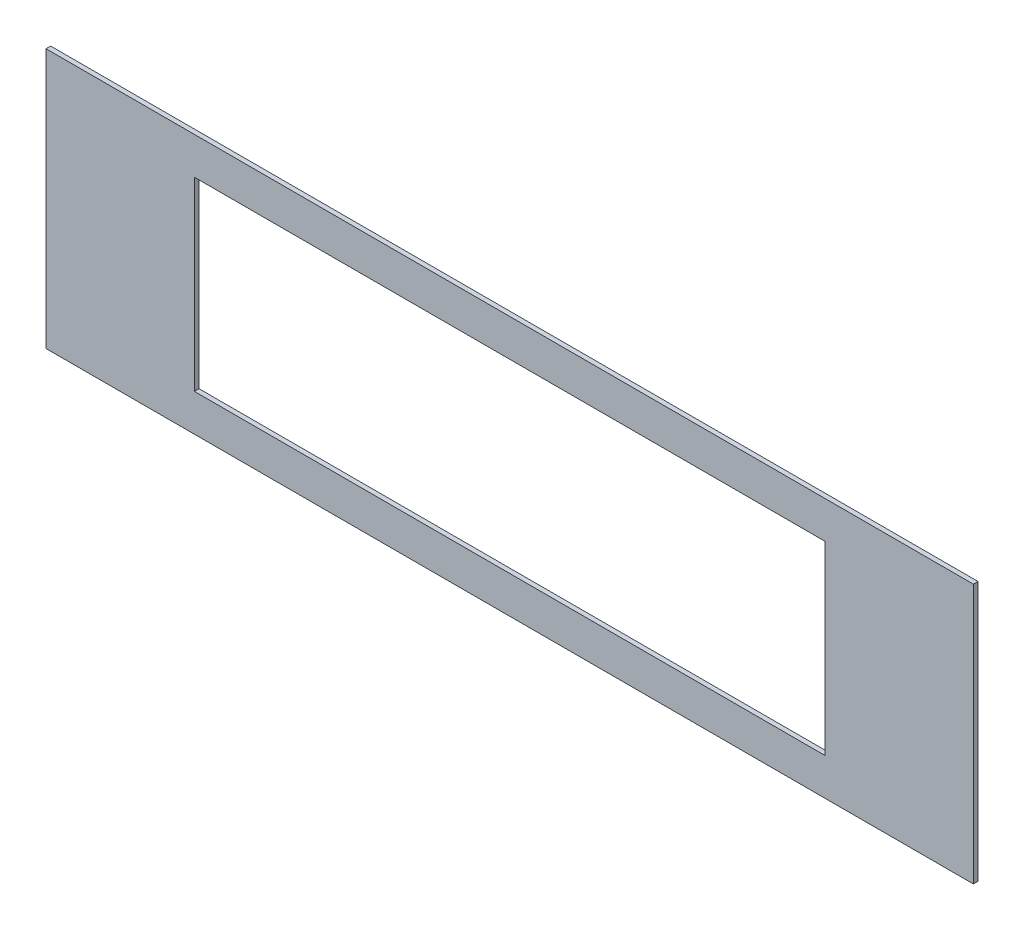
ISO-10303-21;
HEADER;
FILE_DESCRIPTION(('STEP AP214'),'2;1');
FILE_NAME('part.step','',(''),(''),'','','');
FILE_SCHEMA(('AUTOMOTIVE_DESIGN { 1 0 10303 214 1 1 1 1 }'));
ENDSEC;
DATA;
#1=APPLICATION_CONTEXT('core data for automotive mechanical design processes');
#2=APPLICATION_PROTOCOL_DEFINITION('international standard','automotive_design',2000,#1);
#3=PRODUCT_CONTEXT('',#1,'mechanical');
#4=PRODUCT('Part','Part','',(#3));
#5=PRODUCT_RELATED_PRODUCT_CATEGORY('part','',(#4));
#6=PRODUCT_DEFINITION_FORMATION('','',#4);
#7=PRODUCT_DEFINITION_CONTEXT('part definition',#1,'design');
#8=PRODUCT_DEFINITION('design','',#6,#7);
#9=PRODUCT_DEFINITION_SHAPE('','',#8);
#10=(LENGTH_UNIT() NAMED_UNIT(*) SI_UNIT(.MILLI.,.METRE.));
#11=(NAMED_UNIT(*) PLANE_ANGLE_UNIT() SI_UNIT($,.RADIAN.));
#12=(NAMED_UNIT(*) SI_UNIT($,.STERADIAN.) SOLID_ANGLE_UNIT());
#13=UNCERTAINTY_MEASURE_WITH_UNIT(LENGTH_MEASURE(1.E-05),#10,'distance_accuracy_value','');
#14=(GEOMETRIC_REPRESENTATION_CONTEXT(3) GLOBAL_UNCERTAINTY_ASSIGNED_CONTEXT((#13)) GLOBAL_UNIT_ASSIGNED_CONTEXT((#10,
#11,#12)) REPRESENTATION_CONTEXT('',''));
#15=CARTESIAN_POINT('',(0.,0.,0.));
#16=DIRECTION('',(0.,0.,1.));
#17=DIRECTION('',(1.,0.,0.));
#18=AXIS2_PLACEMENT_3D('',#15,#16,#17);
#19=CARTESIAN_POINT('',(0.,0.,6.35));
#20=DIRECTION('',(0.,0.,1.));
#21=DIRECTION('',(1.,0.,0.));
#22=AXIS2_PLACEMENT_3D('',#19,#20,#21);
#23=PLANE('',#22);
#24=DIRECTION('',(0.,-1.,0.));
#25=VECTOR('',#24,1.);
#26=CARTESIAN_POINT('',(-635.,-177.8,6.35));
#27=LINE('',#26,#25);
#28=CARTESIAN_POINT('',(-635.,177.8,6.35));
#29=VERTEX_POINT('',#28);
#30=CARTESIAN_POINT('',(-635.,-177.8,6.35));
#31=VERTEX_POINT('',#30);
#32=EDGE_CURVE('E153',#29,#31,#27,.T.);
#33=ORIENTED_EDGE('',*,*,#32,.T.);
#34=DIRECTION('',(1.,0.,0.));
#35=VECTOR('',#34,1.);
#36=CARTESIAN_POINT('',(635.,-177.8,6.35));
#37=LINE('',#36,#35);
#38=CARTESIAN_POINT('',(635.,-177.8,6.35));
#39=VERTEX_POINT('',#38);
#40=EDGE_CURVE('E157',#31,#39,#37,.T.);
#41=ORIENTED_EDGE('',*,*,#40,.T.);
#42=DIRECTION('',(0.,1.,0.));
#43=VECTOR('',#42,1.);
#44=CARTESIAN_POINT('',(635.,-177.8,6.35));
#45=LINE('',#44,#43);
#46=CARTESIAN_POINT('',(635.,177.8,6.35));
#47=VERTEX_POINT('',#46);
#48=EDGE_CURVE('E161',#39,#47,#45,.T.);
#49=ORIENTED_EDGE('',*,*,#48,.T.);
#50=DIRECTION('',(-1.,0.,0.));
#51=VECTOR('',#50,1.);
#52=CARTESIAN_POINT('',(635.,177.8,6.35));
#53=LINE('',#52,#51);
#54=EDGE_CURVE('E164',#47,#29,#53,.T.);
#55=ORIENTED_EDGE('',*,*,#54,.T.);
#56=EDGE_LOOP('',(#33,#41,#49,#55));
#57=FACE_BOUND('',#56,.T.);
#58=DIRECTION('',(1.,0.,0.));
#59=VECTOR('',#58,1.);
#60=CARTESIAN_POINT('',(431.8,-127.,6.35));
#61=LINE('',#60,#59);
#62=CARTESIAN_POINT('',(-431.8,-127.,6.35));
#63=VERTEX_POINT('',#62);
#64=CARTESIAN_POINT('',(431.8,-127.,6.35));
#65=VERTEX_POINT('',#64);
#66=EDGE_CURVE('E114',#63,#65,#61,.T.);
#67=ORIENTED_EDGE('',*,*,#66,.F.);
#68=DIRECTION('',(0.,-1.,0.));
#69=VECTOR('',#68,1.);
#70=CARTESIAN_POINT('',(-431.8,-127.,6.35));
#71=LINE('',#70,#69);
#72=CARTESIAN_POINT('',(-431.8,127.,6.35));
#73=VERTEX_POINT('',#72);
#74=EDGE_CURVE('E105',#73,#63,#71,.T.);
#75=ORIENTED_EDGE('',*,*,#74,.F.);
#76=DIRECTION('',(-1.,0.,0.));
#77=VECTOR('',#76,1.);
#78=CARTESIAN_POINT('',(431.8,127.,6.35));
#79=LINE('',#78,#77);
#80=CARTESIAN_POINT('',(431.8,127.,6.35));
#81=VERTEX_POINT('',#80);
#82=EDGE_CURVE('E131',#81,#73,#79,.T.);
#83=ORIENTED_EDGE('',*,*,#82,.F.);
#84=DIRECTION('',(0.,1.,0.));
#85=VECTOR('',#84,1.);
#86=CARTESIAN_POINT('',(431.8,-127.,6.35));
#87=LINE('',#86,#85);
#88=EDGE_CURVE('E127',#65,#81,#87,.T.);
#89=ORIENTED_EDGE('',*,*,#88,.F.);
#90=EDGE_LOOP('',(#67,#75,#83,#89));
#91=FACE_BOUND('',#90,.T.);
#92=ADVANCED_FACE('F39',(#57,#91),#23,.T.);
#93=CARTESIAN_POINT('',(0.,0.,0.));
#94=DIRECTION('',(0.,0.,1.));
#95=DIRECTION('',(1.,0.,0.));
#96=AXIS2_PLACEMENT_3D('',#93,#94,#95);
#97=PLANE('',#96);
#98=DIRECTION('',(0.,-1.,0.));
#99=VECTOR('',#98,1.);
#100=CARTESIAN_POINT('',(-635.,-177.8,0.));
#101=LINE('',#100,#99);
#102=CARTESIAN_POINT('',(-635.,177.8,0.));
#103=VERTEX_POINT('',#102);
#104=CARTESIAN_POINT('',(-635.,-177.8,0.));
#105=VERTEX_POINT('',#104);
#106=EDGE_CURVE('E123',#103,#105,#101,.T.);
#107=ORIENTED_EDGE('',*,*,#106,.F.);
#108=DIRECTION('',(-1.,0.,0.));
#109=VECTOR('',#108,1.);
#110=CARTESIAN_POINT('',(635.,177.8,0.));
#111=LINE('',#110,#109);
#112=CARTESIAN_POINT('',(635.,177.8,0.));
#113=VERTEX_POINT('',#112);
#114=EDGE_CURVE('E158',#113,#103,#111,.T.);
#115=ORIENTED_EDGE('',*,*,#114,.F.);
#116=DIRECTION('',(0.,1.,0.));
#117=VECTOR('',#116,1.);
#118=CARTESIAN_POINT('',(635.,-177.8,0.));
#119=LINE('',#118,#117);
#120=CARTESIAN_POINT('',(635.,-177.8,0.));
#121=VERTEX_POINT('',#120);
#122=EDGE_CURVE('E174',#121,#113,#119,.T.);
#123=ORIENTED_EDGE('',*,*,#122,.F.);
#124=DIRECTION('',(1.,0.,0.));
#125=VECTOR('',#124,1.);
#126=CARTESIAN_POINT('',(635.,-177.8,0.));
#127=LINE('',#126,#125);
#128=EDGE_CURVE('E171',#105,#121,#127,.T.);
#129=ORIENTED_EDGE('',*,*,#128,.F.);
#130=EDGE_LOOP('',(#107,#115,#123,#129));
#131=FACE_BOUND('',#130,.T.);
#132=DIRECTION('',(0.,-1.,0.));
#133=VECTOR('',#132,1.);
#134=CARTESIAN_POINT('',(-431.8,-127.,0.));
#135=LINE('',#134,#133);
#136=CARTESIAN_POINT('',(-431.8,127.,0.));
#137=VERTEX_POINT('',#136);
#138=CARTESIAN_POINT('',(-431.8,-127.,0.));
#139=VERTEX_POINT('',#138);
#140=EDGE_CURVE('E63',#137,#139,#135,.T.);
#141=ORIENTED_EDGE('',*,*,#140,.T.);
#142=DIRECTION('',(1.,0.,0.));
#143=VECTOR('',#142,1.);
#144=CARTESIAN_POINT('',(431.8,-127.,0.));
#145=LINE('',#144,#143);
#146=CARTESIAN_POINT('',(431.8,-127.,0.));
#147=VERTEX_POINT('',#146);
#148=EDGE_CURVE('E121',#139,#147,#145,.T.);
#149=ORIENTED_EDGE('',*,*,#148,.T.);
#150=DIRECTION('',(0.,1.,0.));
#151=VECTOR('',#150,1.);
#152=CARTESIAN_POINT('',(431.8,-127.,0.));
#153=LINE('',#152,#151);
#154=CARTESIAN_POINT('',(431.8,127.,0.));
#155=VERTEX_POINT('',#154);
#156=EDGE_CURVE('E140',#147,#155,#153,.T.);
#157=ORIENTED_EDGE('',*,*,#156,.T.);
#158=DIRECTION('',(-1.,0.,0.));
#159=VECTOR('',#158,1.);
#160=CARTESIAN_POINT('',(431.8,127.,0.));
#161=LINE('',#160,#159);
#162=EDGE_CURVE('E115',#155,#137,#161,.T.);
#163=ORIENTED_EDGE('',*,*,#162,.T.);
#164=EDGE_LOOP('',(#141,#149,#157,#163));
#165=FACE_BOUND('',#164,.T.);
#166=ADVANCED_FACE('F197',(#131,#165),#97,.F.);
#167=CARTESIAN_POINT('',(-635.,-177.8,6.35));
#168=DIRECTION('',(1.,0.,0.));
#169=DIRECTION('',(0.,0.,-1.));
#170=AXIS2_PLACEMENT_3D('',#167,#168,#169);
#171=PLANE('',#170);
#172=ORIENTED_EDGE('',*,*,#106,.T.);
#173=DIRECTION('',(0.,0.,-1.));
#174=VECTOR('',#173,1.);
#175=CARTESIAN_POINT('',(-635.,-177.8,6.35));
#176=LINE('',#175,#174);
#177=EDGE_CURVE('E11',#31,#105,#176,.T.);
#178=ORIENTED_EDGE('',*,*,#177,.F.);
#179=ORIENTED_EDGE('',*,*,#32,.F.);
#180=DIRECTION('',(0.,0.,-1.));
#181=VECTOR('',#180,1.);
#182=CARTESIAN_POINT('',(-635.,177.8,6.35));
#183=LINE('',#182,#181);
#184=EDGE_CURVE('E167',#29,#103,#183,.T.);
#185=ORIENTED_EDGE('',*,*,#184,.T.);
#186=EDGE_LOOP('',(#172,#178,#179,#185));
#187=FACE_BOUND('',#186,.T.);
#188=ADVANCED_FACE('F41',(#187),#171,.F.);
#189=CARTESIAN_POINT('',(635.,-177.8,6.35));
#190=DIRECTION('',(0.,1.,0.));
#191=DIRECTION('',(0.,0.,1.));
#192=AXIS2_PLACEMENT_3D('',#189,#190,#191);
#193=PLANE('',#192);
#194=ORIENTED_EDGE('',*,*,#128,.T.);
#195=DIRECTION('',(0.,0.,-1.));
#196=VECTOR('',#195,1.);
#197=CARTESIAN_POINT('',(635.,-177.8,6.35));
#198=LINE('',#197,#196);
#199=EDGE_CURVE('E48',#39,#121,#198,.T.);
#200=ORIENTED_EDGE('',*,*,#199,.F.);
#201=ORIENTED_EDGE('',*,*,#40,.F.);
#202=ORIENTED_EDGE('',*,*,#177,.T.);
#203=EDGE_LOOP('',(#194,#200,#201,#202));
#204=FACE_BOUND('',#203,.T.);
#205=ADVANCED_FACE('F207',(#204),#193,.F.);
#206=CARTESIAN_POINT('',(635.,-177.8,6.35));
#207=DIRECTION('',(-1.,0.,0.));
#208=DIRECTION('',(0.,0.,1.));
#209=AXIS2_PLACEMENT_3D('',#206,#207,#208);
#210=PLANE('',#209);
#211=ORIENTED_EDGE('',*,*,#122,.T.);
#212=DIRECTION('',(0.,0.,-1.));
#213=VECTOR('',#212,1.);
#214=CARTESIAN_POINT('',(635.,177.8,6.35));
#215=LINE('',#214,#213);
#216=EDGE_CURVE('E182',#47,#113,#215,.T.);
#217=ORIENTED_EDGE('',*,*,#216,.F.);
#218=ORIENTED_EDGE('',*,*,#48,.F.);
#219=ORIENTED_EDGE('',*,*,#199,.T.);
#220=EDGE_LOOP('',(#211,#217,#218,#219));
#221=FACE_BOUND('',#220,.T.);
#222=ADVANCED_FACE('F191',(#221),#210,.F.);
#223=CARTESIAN_POINT('',(635.,177.8,6.35));
#224=DIRECTION('',(0.,-1.,0.));
#225=DIRECTION('',(0.,0.,-1.));
#226=AXIS2_PLACEMENT_3D('',#223,#224,#225);
#227=PLANE('',#226);
#228=ORIENTED_EDGE('',*,*,#114,.T.);
#229=ORIENTED_EDGE('',*,*,#184,.F.);
#230=ORIENTED_EDGE('',*,*,#54,.F.);
#231=ORIENTED_EDGE('',*,*,#216,.T.);
#232=EDGE_LOOP('',(#228,#229,#230,#231));
#233=FACE_BOUND('',#232,.T.);
#234=ADVANCED_FACE('F201',(#233),#227,.F.);
#235=CARTESIAN_POINT('',(-431.8,-127.,6.35));
#236=DIRECTION('',(1.,0.,0.));
#237=DIRECTION('',(0.,0.,-1.));
#238=AXIS2_PLACEMENT_3D('',#235,#236,#237);
#239=PLANE('',#238);
#240=ORIENTED_EDGE('',*,*,#140,.F.);
#241=DIRECTION('',(0.,0.,-1.));
#242=VECTOR('',#241,1.);
#243=CARTESIAN_POINT('',(-431.8,127.,6.35));
#244=LINE('',#243,#242);
#245=EDGE_CURVE('E109',#73,#137,#244,.T.);
#246=ORIENTED_EDGE('',*,*,#245,.F.);
#247=ORIENTED_EDGE('',*,*,#74,.T.);
#248=DIRECTION('',(0.,0.,-1.));
#249=VECTOR('',#248,1.);
#250=CARTESIAN_POINT('',(-431.8,-127.,6.35));
#251=LINE('',#250,#249);
#252=EDGE_CURVE('E108',#63,#139,#251,.T.);
#253=ORIENTED_EDGE('',*,*,#252,.T.);
#254=EDGE_LOOP('',(#240,#246,#247,#253));
#255=FACE_BOUND('',#254,.T.);
#256=ADVANCED_FACE('F107',(#255),#239,.T.);
#257=CARTESIAN_POINT('',(431.8,-127.,6.35));
#258=DIRECTION('',(0.,1.,0.));
#259=DIRECTION('',(-1.,0.,0.));
#260=AXIS2_PLACEMENT_3D('',#257,#258,#259);
#261=PLANE('',#260);
#262=ORIENTED_EDGE('',*,*,#148,.F.);
#263=ORIENTED_EDGE('',*,*,#252,.F.);
#264=ORIENTED_EDGE('',*,*,#66,.T.);
#265=DIRECTION('',(0.,0.,-1.));
#266=VECTOR('',#265,1.);
#267=CARTESIAN_POINT('',(431.8,-127.,6.35));
#268=LINE('',#267,#266);
#269=EDGE_CURVE('E124',#65,#147,#268,.T.);
#270=ORIENTED_EDGE('',*,*,#269,.T.);
#271=EDGE_LOOP('',(#262,#263,#264,#270));
#272=FACE_BOUND('',#271,.T.);
#273=ADVANCED_FACE('F118',(#272),#261,.T.);
#274=CARTESIAN_POINT('',(431.8,-127.,6.35));
#275=DIRECTION('',(-1.,0.,0.));
#276=DIRECTION('',(0.,0.,1.));
#277=AXIS2_PLACEMENT_3D('',#274,#275,#276);
#278=PLANE('',#277);
#279=ORIENTED_EDGE('',*,*,#156,.F.);
#280=ORIENTED_EDGE('',*,*,#269,.F.);
#281=ORIENTED_EDGE('',*,*,#88,.T.);
#282=DIRECTION('',(0.,0.,-1.));
#283=VECTOR('',#282,1.);
#284=CARTESIAN_POINT('',(431.8,127.,6.35));
#285=LINE('',#284,#283);
#286=EDGE_CURVE('E55',#81,#155,#285,.T.);
#287=ORIENTED_EDGE('',*,*,#286,.T.);
#288=EDGE_LOOP('',(#279,#280,#281,#287));
#289=FACE_BOUND('',#288,.T.);
#290=ADVANCED_FACE('F230',(#289),#278,.T.);
#291=CARTESIAN_POINT('',(431.8,127.,6.35));
#292=DIRECTION('',(0.,-1.,0.));
#293=DIRECTION('',(1.,0.,0.));
#294=AXIS2_PLACEMENT_3D('',#291,#292,#293);
#295=PLANE('',#294);
#296=ORIENTED_EDGE('',*,*,#162,.F.);
#297=ORIENTED_EDGE('',*,*,#286,.F.);
#298=ORIENTED_EDGE('',*,*,#82,.T.);
#299=ORIENTED_EDGE('',*,*,#245,.T.);
#300=EDGE_LOOP('',(#296,#297,#298,#299));
#301=FACE_BOUND('',#300,.T.);
#302=ADVANCED_FACE('F234',(#301),#295,.T.);
#303=CLOSED_SHELL('',(#92,#166,#188,#205,#222,#234,#256,#273,#290,#302));
#304=MANIFOLD_SOLID_BREP('B2',#303);
#305=ADVANCED_BREP_SHAPE_REPRESENTATION('',(#18,#304),#14);
#306=SHAPE_DEFINITION_REPRESENTATION(#9,#305);
ENDSEC;
END-ISO-10303-21;
